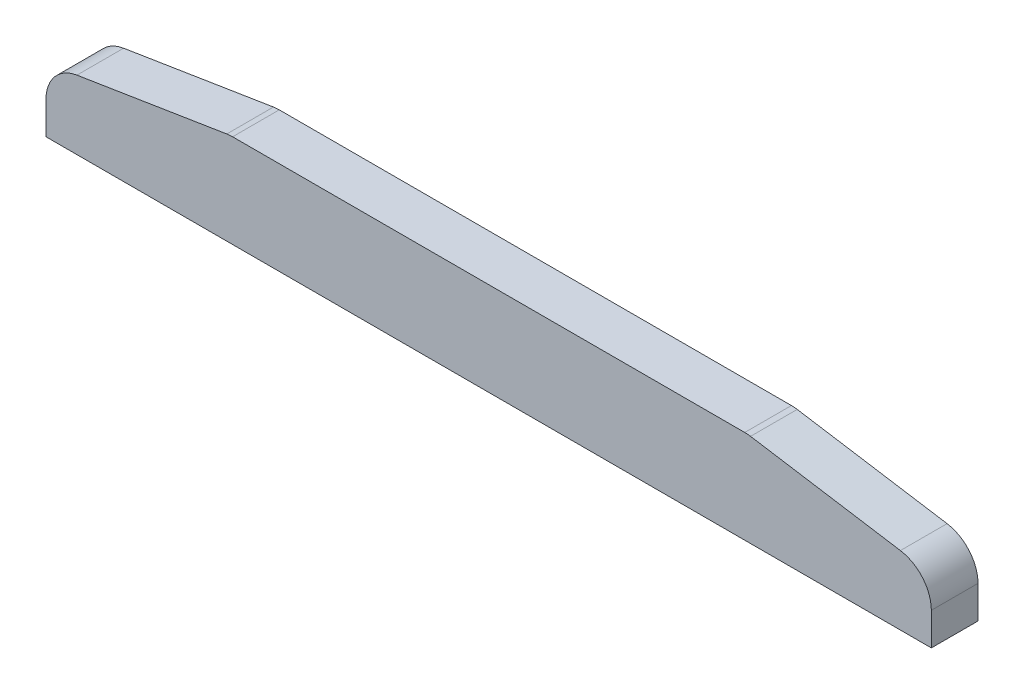
ISO-10303-21;
HEADER;
FILE_DESCRIPTION(('STEP AP214'),'2;1');
FILE_NAME('part.step','',(''),(''),'','','');
FILE_SCHEMA(('AUTOMOTIVE_DESIGN { 1 0 10303 214 1 1 1 1 }'));
ENDSEC;
DATA;
#1=APPLICATION_CONTEXT('core data for automotive mechanical design processes');
#2=APPLICATION_PROTOCOL_DEFINITION('international standard','automotive_design',2000,#1);
#3=PRODUCT_CONTEXT('',#1,'mechanical');
#4=PRODUCT('Part','Part','',(#3));
#5=PRODUCT_RELATED_PRODUCT_CATEGORY('part','',(#4));
#6=PRODUCT_DEFINITION_FORMATION('','',#4);
#7=PRODUCT_DEFINITION_CONTEXT('part definition',#1,'design');
#8=PRODUCT_DEFINITION('design','',#6,#7);
#9=PRODUCT_DEFINITION_SHAPE('','',#8);
#10=(LENGTH_UNIT() NAMED_UNIT(*) SI_UNIT(.MILLI.,.METRE.));
#11=(NAMED_UNIT(*) PLANE_ANGLE_UNIT() SI_UNIT($,.RADIAN.));
#12=(NAMED_UNIT(*) SI_UNIT($,.STERADIAN.) SOLID_ANGLE_UNIT());
#13=UNCERTAINTY_MEASURE_WITH_UNIT(LENGTH_MEASURE(1.E-05),#10,'distance_accuracy_value','');
#14=(GEOMETRIC_REPRESENTATION_CONTEXT(3) GLOBAL_UNCERTAINTY_ASSIGNED_CONTEXT((#13)) GLOBAL_UNIT_ASSIGNED_CONTEXT((#10,
#11,#12)) REPRESENTATION_CONTEXT('',''));
#15=CARTESIAN_POINT('',(0.,0.,0.));
#16=DIRECTION('',(0.,0.,1.));
#17=DIRECTION('',(1.,0.,0.));
#18=AXIS2_PLACEMENT_3D('',#15,#16,#17);
#19=CARTESIAN_POINT('',(120.5,25.4,6.35000000000008));
#20=DIRECTION('',(-1.00000000000005,0.,0.));
#21=DIRECTION('',(0.,0.,1.00000000000005));
#22=AXIS2_PLACEMENT_3D('',#19,#20,#21);
#23=PLANE('',#22);
#24=DIRECTION('',(0.,-1.,0.));
#25=VECTOR('',#24,1.);
#26=CARTESIAN_POINT('',(120.5,25.4,-6.35000000000052));
#27=LINE('',#26,#25);
#28=CARTESIAN_POINT('',(120.5,8.87280887906233,-6.35000000000052));
#29=VERTEX_POINT('',#28);
#30=CARTESIAN_POINT('',(120.5,0.,-6.35000000000008));
#31=VERTEX_POINT('',#30);
#32=EDGE_CURVE('E212',#29,#31,#27,.T.);
#33=ORIENTED_EDGE('',*,*,#32,.F.);
#34=DIRECTION('',(0.,0.,-1.00000000000005));
#35=VECTOR('',#34,1.);
#36=CARTESIAN_POINT('',(120.5,8.87280887906217,6.35000000000008));
#37=LINE('',#36,#35);
#38=CARTESIAN_POINT('',(120.5,8.87280887906217,6.35000000000008));
#39=VERTEX_POINT('',#38);
#40=EDGE_CURVE('E225',#29,#39,#37,.F.);
#41=ORIENTED_EDGE('',*,*,#40,.T.);
#42=DIRECTION('',(0.,-1.,0.));
#43=VECTOR('',#42,1.);
#44=CARTESIAN_POINT('',(120.5,25.4,6.35000000000008));
#45=LINE('',#44,#43);
#46=CARTESIAN_POINT('',(120.5,0.,6.35000000000008));
#47=VERTEX_POINT('',#46);
#48=EDGE_CURVE('E196',#39,#47,#45,.T.);
#49=ORIENTED_EDGE('',*,*,#48,.T.);
#50=DIRECTION('',(0.,0.,-1.00000000000005));
#51=VECTOR('',#50,1.);
#52=CARTESIAN_POINT('',(120.5,0.,6.35000000000008));
#53=LINE('',#52,#51);
#54=EDGE_CURVE('E188',#47,#31,#53,.T.);
#55=ORIENTED_EDGE('',*,*,#54,.T.);
#56=EDGE_LOOP('',(#33,#41,#49,#55));
#57=FACE_BOUND('',#56,.T.);
#58=ADVANCED_FACE('F50',(#57),#23,.F.);
#59=CARTESIAN_POINT('',(-120.500000000001,25.3999999999938,-6.35000000000008));
#60=DIRECTION('',(0.,0.,1.00000000000005));
#61=DIRECTION('',(1.00000000000005,0.,0.));
#62=AXIS2_PLACEMENT_3D('',#59,#60,#61);
#63=PLANE('',#62);
#64=DIRECTION('',(-0.987440631916757,0.157990501106668,0.));
#65=VECTOR('',#64,1.);
#66=CARTESIAN_POINT('',(70.4999999999989,25.4,-6.34999999999997));
#67=LINE('',#66,#65);
#68=CARTESIAN_POINT('',(71.2849605052048,25.274406319167,-6.34999999999997));
#69=VERTEX_POINT('',#68);
#70=CARTESIAN_POINT('',(112.079905011067,18.7472151982294,-6.34999999999986));
#71=VERTEX_POINT('',#70);
#72=EDGE_CURVE('E216',#69,#71,#67,.F.);
#73=ORIENTED_EDGE('',*,*,#72,.T.);
#74=CARTESIAN_POINT('',(110.5,8.87280887906228,-6.34999999999986));
#75=DIRECTION('',(0.,0.,1.00000000000005));
#76=DIRECTION('',(1.00000000000005,0.,0.));
#77=AXIS2_PLACEMENT_3D('',#74,#75,#76);
#78=CIRCLE('',#77,10.);
#79=EDGE_CURVE('E245',#71,#29,#78,.F.);
#80=ORIENTED_EDGE('',*,*,#79,.T.);
#81=ORIENTED_EDGE('',*,*,#32,.T.);
#82=DIRECTION('',(-1.00000000000005,0.,0.));
#83=VECTOR('',#82,1.);
#84=CARTESIAN_POINT('',(-120.5,-6.21724893790088E-12,-6.34999999999986));
#85=LINE('',#84,#83);
#86=CARTESIAN_POINT('',(-120.5,-6.21724893790088E-12,-6.34999999999986));
#87=VERTEX_POINT('',#86);
#88=EDGE_CURVE('E199',#31,#87,#85,.T.);
#89=ORIENTED_EDGE('',*,*,#88,.T.);
#90=DIRECTION('',(0.,-1.,0.));
#91=VECTOR('',#90,1.);
#92=CARTESIAN_POINT('',(-120.500000000001,25.3999999999938,-6.35000000000008));
#93=LINE('',#92,#91);
#94=CARTESIAN_POINT('',(-120.500000000001,8.87280887905606,-6.35000000000008));
#95=VERTEX_POINT('',#94);
#96=EDGE_CURVE('E210',#95,#87,#93,.T.);
#97=ORIENTED_EDGE('',*,*,#96,.F.);
#98=CARTESIAN_POINT('',(-110.500000000001,8.87280887905606,-6.35000000000008));
#99=DIRECTION('',(0.,0.,1.00000000000005));
#100=DIRECTION('',(1.00000000000005,0.,0.));
#101=AXIS2_PLACEMENT_3D('',#98,#99,#100);
#102=CIRCLE('',#101,10.);
#103=CARTESIAN_POINT('',(-112.079905011067,18.7472151982231,-6.35000000000008));
#104=VERTEX_POINT('',#103);
#105=EDGE_CURVE('E71',#95,#104,#102,.F.);
#106=ORIENTED_EDGE('',*,*,#105,.T.);
#107=DIRECTION('',(-0.987440631916754,-0.157990501106671,0.));
#108=VECTOR('',#107,1.);
#109=CARTESIAN_POINT('',(-70.5000000000022,25.3999999999938,-6.35000000000074));
#110=LINE('',#109,#108);
#111=CARTESIAN_POINT('',(-71.2849605052068,25.2744063191609,-6.35000000000041));
#112=VERTEX_POINT('',#111);
#113=EDGE_CURVE('E214',#104,#112,#110,.F.);
#114=ORIENTED_EDGE('',*,*,#113,.T.);
#115=CARTESIAN_POINT('',(-69.7050554941383,15.3999999999938,-6.34999999999997));
#116=DIRECTION('',(0.,0.,1.00000000000005));
#117=DIRECTION('',(1.00000000000005,0.,0.));
#118=AXIS2_PLACEMENT_3D('',#115,#116,#117);
#119=CIRCLE('',#118,10.);
#120=CARTESIAN_POINT('',(-69.7050554941385,25.3999999999938,-6.3500000000003));
#121=VERTEX_POINT('',#120);
#122=EDGE_CURVE('E241',#112,#121,#119,.F.);
#123=ORIENTED_EDGE('',*,*,#122,.T.);
#124=DIRECTION('',(-1.00000000000005,0.,0.));
#125=VECTOR('',#124,1.);
#126=CARTESIAN_POINT('',(-120.500000000001,25.3999999999938,-6.35000000000008));
#127=LINE('',#126,#125);
#128=CARTESIAN_POINT('',(69.7050554941381,25.4,-6.35000000000008));
#129=VERTEX_POINT('',#128);
#130=EDGE_CURVE('E189',#129,#121,#127,.T.);
#131=ORIENTED_EDGE('',*,*,#130,.F.);
#132=CARTESIAN_POINT('',(69.7050554941381,15.4,-6.35000000000008));
#133=DIRECTION('',(0.,0.,1.00000000000005));
#134=DIRECTION('',(1.00000000000005,0.,0.));
#135=AXIS2_PLACEMENT_3D('',#132,#133,#134);
#136=CIRCLE('',#135,10.);
#137=EDGE_CURVE('E243',#129,#69,#136,.F.);
#138=ORIENTED_EDGE('',*,*,#137,.T.);
#139=EDGE_LOOP('',(#73,#80,#81,#89,#97,#106,#114,#123,#131,#138));
#140=FACE_BOUND('',#139,.T.);
#141=ADVANCED_FACE('F266',(#140),#63,.F.);
#142=CARTESIAN_POINT('',(-120.500000000002,25.3999999999939,6.34999999999997));
#143=DIRECTION('',(1.00000000000005,0.,0.));
#144=DIRECTION('',(0.,0.,-1.00000000000005));
#145=AXIS2_PLACEMENT_3D('',#142,#143,#144);
#146=PLANE('',#145);
#147=DIRECTION('',(0.,-1.,0.));
#148=VECTOR('',#147,1.);
#149=CARTESIAN_POINT('',(-120.500000000002,25.3999999999939,6.34999999999997));
#150=LINE('',#149,#148);
#151=CARTESIAN_POINT('',(-120.500000000004,8.87280887905606,6.3500000000003));
#152=VERTEX_POINT('',#151);
#153=CARTESIAN_POINT('',(-120.500000000003,-6.21724893790088E-12,6.35000000000008));
#154=VERTEX_POINT('',#153);
#155=EDGE_CURVE('E208',#152,#154,#150,.T.);
#156=ORIENTED_EDGE('',*,*,#155,.F.);
#157=DIRECTION('',(0.,0.,1.00000000000005));
#158=VECTOR('',#157,1.);
#159=CARTESIAN_POINT('',(-120.500000000001,8.87280887905606,-6.35000000000008));
#160=LINE('',#159,#158);
#161=EDGE_CURVE('E13',#152,#95,#160,.F.);
#162=ORIENTED_EDGE('',*,*,#161,.T.);
#163=ORIENTED_EDGE('',*,*,#96,.T.);
#164=DIRECTION('',(0.,0.,1.00000000000005));
#165=VECTOR('',#164,1.);
#166=CARTESIAN_POINT('',(-120.500000000003,-6.21724893790088E-12,6.35000000000008));
#167=LINE('',#166,#165);
#168=EDGE_CURVE('E202',#87,#154,#167,.T.);
#169=ORIENTED_EDGE('',*,*,#168,.T.);
#170=EDGE_LOOP('',(#156,#162,#163,#169));
#171=FACE_BOUND('',#170,.T.);
#172=ADVANCED_FACE('F265',(#171),#146,.F.);
#173=CARTESIAN_POINT('',(-120.500000000002,25.3999999999939,6.34999999999997));
#174=DIRECTION('',(0.,0.,-1.00000000000005));
#175=DIRECTION('',(-1.00000000000005,0.,0.));
#176=AXIS2_PLACEMENT_3D('',#173,#174,#175);
#177=PLANE('',#176);
#178=ORIENTED_EDGE('',*,*,#48,.F.);
#179=CARTESIAN_POINT('',(110.5,8.87280887906217,6.3500000000003));
#180=DIRECTION('',(0.,0.,-1.00000000000005));
#181=DIRECTION('',(-1.00000000000005,0.,0.));
#182=AXIS2_PLACEMENT_3D('',#179,#180,#181);
#183=CIRCLE('',#182,10.);
#184=CARTESIAN_POINT('',(112.079905011067,18.7472151982293,6.35000000000008));
#185=VERTEX_POINT('',#184);
#186=EDGE_CURVE('E234',#39,#185,#183,.F.);
#187=ORIENTED_EDGE('',*,*,#186,.T.);
#188=DIRECTION('',(0.987440631916757,-0.157990501106668,0.));
#189=VECTOR('',#188,1.);
#190=CARTESIAN_POINT('',(70.4999999999989,25.4,6.34999999999997));
#191=LINE('',#190,#189);
#192=CARTESIAN_POINT('',(71.2849605052048,25.274406319167,6.35000000000041));
#193=VERTEX_POINT('',#192);
#194=EDGE_CURVE('E222',#185,#193,#191,.F.);
#195=ORIENTED_EDGE('',*,*,#194,.T.);
#196=CARTESIAN_POINT('',(69.7050554941383,15.4,6.34999999999997));
#197=DIRECTION('',(0.,0.,-1.00000000000005));
#198=DIRECTION('',(-1.00000000000005,0.,0.));
#199=AXIS2_PLACEMENT_3D('',#196,#197,#198);
#200=CIRCLE('',#199,10.);
#201=CARTESIAN_POINT('',(69.7050554941383,25.4,6.34999999999997));
#202=VERTEX_POINT('',#201);
#203=EDGE_CURVE('E232',#193,#202,#200,.F.);
#204=ORIENTED_EDGE('',*,*,#203,.T.);
#205=DIRECTION('',(1.00000000000005,0.,0.));
#206=VECTOR('',#205,1.);
#207=CARTESIAN_POINT('',(-120.500000000002,25.3999999999939,6.34999999999997));
#208=LINE('',#207,#206);
#209=CARTESIAN_POINT('',(-69.7050554941392,25.3999999999939,6.34999999999963));
#210=VERTEX_POINT('',#209);
#211=EDGE_CURVE('E192',#210,#202,#208,.T.);
#212=ORIENTED_EDGE('',*,*,#211,.F.);
#213=CARTESIAN_POINT('',(-69.7050554941383,15.3999999999939,6.34999999999986));
#214=DIRECTION('',(0.,0.,-1.00000000000005));
#215=DIRECTION('',(-1.00000000000005,0.,0.));
#216=AXIS2_PLACEMENT_3D('',#213,#214,#215);
#217=CIRCLE('',#216,10.);
#218=CARTESIAN_POINT('',(-71.2849605052059,25.2744063191609,6.34999999999986));
#219=VERTEX_POINT('',#218);
#220=EDGE_CURVE('E230',#210,#219,#217,.F.);
#221=ORIENTED_EDGE('',*,*,#220,.T.);
#222=DIRECTION('',(0.987440631916754,0.157990501106671,0.));
#223=VECTOR('',#222,1.);
#224=CARTESIAN_POINT('',(-70.4999999999996,25.3999999999939,6.34999999999986));
#225=LINE('',#224,#223);
#226=CARTESIAN_POINT('',(-112.07990501107,18.7472151982231,6.34999999999963));
#227=VERTEX_POINT('',#226);
#228=EDGE_CURVE('E219',#219,#227,#225,.F.);
#229=ORIENTED_EDGE('',*,*,#228,.T.);
#230=CARTESIAN_POINT('',(-110.500000000001,8.87280887906211,6.35000000000019));
#231=DIRECTION('',(0.,0.,-1.00000000000005));
#232=DIRECTION('',(-1.00000000000005,0.,0.));
#233=AXIS2_PLACEMENT_3D('',#230,#231,#232);
#234=CIRCLE('',#233,10.);
#235=EDGE_CURVE('E228',#227,#152,#234,.F.);
#236=ORIENTED_EDGE('',*,*,#235,.T.);
#237=ORIENTED_EDGE('',*,*,#155,.T.);
#238=DIRECTION('',(1.00000000000005,0.,0.));
#239=VECTOR('',#238,1.);
#240=CARTESIAN_POINT('',(-120.500000000003,-6.21724893790088E-12,6.35000000000008));
#241=LINE('',#240,#239);
#242=EDGE_CURVE('E193',#154,#47,#241,.T.);
#243=ORIENTED_EDGE('',*,*,#242,.T.);
#244=EDGE_LOOP('',(#178,#187,#195,#204,#212,#221,#229,#236,#237,#243));
#245=FACE_BOUND('',#244,.T.);
#246=ADVANCED_FACE('F260',(#245),#177,.F.);
#247=CARTESIAN_POINT('',(0.,25.4,0.));
#248=DIRECTION('',(0.,-1.,0.));
#249=DIRECTION('',(0.,0.,-1.00000000000005));
#250=AXIS2_PLACEMENT_3D('',#247,#248,#249);
#251=PLANE('',#250);
#252=ORIENTED_EDGE('',*,*,#211,.T.);
#253=DIRECTION('',(0.,0.,1.00000000000005));
#254=VECTOR('',#253,1.);
#255=CARTESIAN_POINT('',(69.7050554941381,25.4,-6.35000000000008));
#256=LINE('',#255,#254);
#257=EDGE_CURVE('E250',#202,#129,#256,.F.);
#258=ORIENTED_EDGE('',*,*,#257,.T.);
#259=ORIENTED_EDGE('',*,*,#130,.T.);
#260=DIRECTION('',(0.,0.,-1.00000000000005));
#261=VECTOR('',#260,1.);
#262=CARTESIAN_POINT('',(-69.7050554941392,25.3999999999939,6.34999999999963));
#263=LINE('',#262,#261);
#264=EDGE_CURVE('E247',#121,#210,#263,.F.);
#265=ORIENTED_EDGE('',*,*,#264,.T.);
#266=EDGE_LOOP('',(#252,#258,#259,#265));
#267=FACE_BOUND('',#266,.T.);
#268=ADVANCED_FACE('F291',(#267),#251,.F.);
#269=CARTESIAN_POINT('',(0.,0.,0.));
#270=DIRECTION('',(0.,-1.,0.));
#271=DIRECTION('',(0.,0.,-1.00000000000005));
#272=AXIS2_PLACEMENT_3D('',#269,#270,#271);
#273=PLANE('',#272);
#274=CARTESIAN_POINT('',(-112.5,-6.21724893790088E-12,0.));
#275=DIRECTION('',(0.,-1.,0.));
#276=DIRECTION('',(0.,0.,-1.00000000000005));
#277=AXIS2_PLACEMENT_3D('',#274,#275,#276);
#278=CIRCLE('',#277,2.09999999999999);
#279=CARTESIAN_POINT('',(-112.5,-6.21974521069131E-12,-2.10000000000009));
#280=VERTEX_POINT('',#279);
#281=EDGE_CURVE('E154',#280,#280,#278,.T.);
#282=ORIENTED_EDGE('',*,*,#281,.F.);
#283=EDGE_LOOP('',(#282));
#284=FACE_BOUND('',#283,.T.);
#285=CARTESIAN_POINT('',(-67.5000000000001,-6.21724893790088E-12,0.));
#286=DIRECTION('',(0.,-1.,0.));
#287=DIRECTION('',(0.,0.,-1.00000000000005));
#288=AXIS2_PLACEMENT_3D('',#285,#286,#287);
#289=CIRCLE('',#288,2.09999999999999);
#290=CARTESIAN_POINT('',(-67.5000000000001,-6.21974521069131E-12,-2.10000000000009));
#291=VERTEX_POINT('',#290);
#292=EDGE_CURVE('E153',#291,#291,#289,.T.);
#293=ORIENTED_EDGE('',*,*,#292,.F.);
#294=EDGE_LOOP('',(#293));
#295=FACE_BOUND('',#294,.T.);
#296=CARTESIAN_POINT('',(-22.5000000000009,0.,1.11022302462516E-13));
#297=DIRECTION('',(0.,-1.,0.));
#298=DIRECTION('',(0.,0.,-1.00000000000005));
#299=AXIS2_PLACEMENT_3D('',#296,#297,#298);
#300=CIRCLE('',#299,2.09999999999999);
#301=CARTESIAN_POINT('',(-22.5000000000009,0.,-2.09999999999998));
#302=VERTEX_POINT('',#301);
#303=EDGE_CURVE('E164',#302,#302,#300,.T.);
#304=ORIENTED_EDGE('',*,*,#303,.F.);
#305=EDGE_LOOP('',(#304));
#306=FACE_BOUND('',#305,.T.);
#307=CARTESIAN_POINT('',(22.5,0.,-2.22044604925031E-13));
#308=DIRECTION('',(0.,-1.,0.));
#309=DIRECTION('',(0.,0.,-1.00000000000005));
#310=AXIS2_PLACEMENT_3D('',#307,#308,#309);
#311=CIRCLE('',#310,2.09999999999999);
#312=CARTESIAN_POINT('',(22.5,0.,-2.10000000000032));
#313=VERTEX_POINT('',#312);
#314=EDGE_CURVE('E170',#313,#313,#311,.T.);
#315=ORIENTED_EDGE('',*,*,#314,.F.);
#316=EDGE_LOOP('',(#315));
#317=FACE_BOUND('',#316,.T.);
#318=CARTESIAN_POINT('',(67.4999999999999,0.,-2.22044604925031E-13));
#319=DIRECTION('',(0.,-1.,0.));
#320=DIRECTION('',(0.,0.,-1.00000000000005));
#321=AXIS2_PLACEMENT_3D('',#318,#319,#320);
#322=CIRCLE('',#321,2.09999999999999);
#323=CARTESIAN_POINT('',(67.4999999999999,0.,-2.10000000000032));
#324=VERTEX_POINT('',#323);
#325=EDGE_CURVE('E176',#324,#324,#322,.T.);
#326=ORIENTED_EDGE('',*,*,#325,.F.);
#327=EDGE_LOOP('',(#326));
#328=FACE_BOUND('',#327,.T.);
#329=CARTESIAN_POINT('',(112.5,0.,0.));
#330=DIRECTION('',(0.,-1.,0.));
#331=DIRECTION('',(0.,0.,-1.00000000000005));
#332=AXIS2_PLACEMENT_3D('',#329,#330,#331);
#333=CIRCLE('',#332,2.09999999999999);
#334=CARTESIAN_POINT('',(112.5,0.,-2.10000000000009));
#335=VERTEX_POINT('',#334);
#336=EDGE_CURVE('E182',#335,#335,#333,.T.);
#337=ORIENTED_EDGE('',*,*,#336,.F.);
#338=EDGE_LOOP('',(#337));
#339=FACE_BOUND('',#338,.T.);
#340=ORIENTED_EDGE('',*,*,#54,.F.);
#341=ORIENTED_EDGE('',*,*,#242,.F.);
#342=ORIENTED_EDGE('',*,*,#168,.F.);
#343=ORIENTED_EDGE('',*,*,#88,.F.);
#344=EDGE_LOOP('',(#340,#341,#342,#343));
#345=FACE_BOUND('',#344,.T.);
#346=ADVANCED_FACE('F273',(#284,#295,#306,#317,#328,#339,#345),#273,.T.);
#347=CARTESIAN_POINT('',(70.4999999999987,25.4,-2.22044604925031E-13));
#348=DIRECTION('',(-0.157990501106679,-0.987440631916706,0.));
#349=DIRECTION('',(0.,0.,-1.00000000000005));
#350=AXIS2_PLACEMENT_3D('',#347,#348,#349);
#351=PLANE('',#350);
#352=ORIENTED_EDGE('',*,*,#194,.F.);
#353=DIRECTION('',(0.,0.,1.00000000000005));
#354=VECTOR('',#353,1.);
#355=CARTESIAN_POINT('',(112.079905011067,18.7472151982294,-6.34999999999986));
#356=LINE('',#355,#354);
#357=EDGE_CURVE('E238',#185,#71,#356,.F.);
#358=ORIENTED_EDGE('',*,*,#357,.T.);
#359=ORIENTED_EDGE('',*,*,#72,.F.);
#360=DIRECTION('',(0.,0.,-1.00000000000005));
#361=VECTOR('',#360,1.);
#362=CARTESIAN_POINT('',(71.2849605052048,25.274406319167,6.35000000000041));
#363=LINE('',#362,#361);
#364=EDGE_CURVE('E236',#69,#193,#363,.F.);
#365=ORIENTED_EDGE('',*,*,#364,.T.);
#366=EDGE_LOOP('',(#352,#358,#359,#365));
#367=FACE_BOUND('',#366,.T.);
#368=ADVANCED_FACE('F283',(#367),#351,.F.);
#369=CARTESIAN_POINT('',(-70.4999999999991,25.3999999999938,1.11022302462516E-13));
#370=DIRECTION('',(0.157990501106677,-0.987440631916706,0.));
#371=DIRECTION('',(0.,0.,1.00000000000005));
#372=AXIS2_PLACEMENT_3D('',#369,#370,#371);
#373=PLANE('',#372);
#374=ORIENTED_EDGE('',*,*,#228,.F.);
#375=DIRECTION('',(0.,0.,1.00000000000005));
#376=VECTOR('',#375,1.);
#377=CARTESIAN_POINT('',(-71.284960505205,25.2744063191609,-6.35000000000008));
#378=LINE('',#377,#376);
#379=EDGE_CURVE('E58',#219,#112,#378,.F.);
#380=ORIENTED_EDGE('',*,*,#379,.T.);
#381=ORIENTED_EDGE('',*,*,#113,.F.);
#382=DIRECTION('',(0.,0.,-1.00000000000005));
#383=VECTOR('',#382,1.);
#384=CARTESIAN_POINT('',(-112.07990501107,18.7472151982231,6.34999999999963));
#385=LINE('',#384,#383);
#386=EDGE_CURVE('E253',#104,#227,#385,.F.);
#387=ORIENTED_EDGE('',*,*,#386,.T.);
#388=EDGE_LOOP('',(#374,#380,#381,#387));
#389=FACE_BOUND('',#388,.T.);
#390=ADVANCED_FACE('F255',(#389),#373,.F.);
#391=CARTESIAN_POINT('',(112.5,12.0000000000001,0.));
#392=DIRECTION('',(0.,-1.,0.));
#393=DIRECTION('',(0.,0.,-1.00000000000005));
#394=AXIS2_PLACEMENT_3D('',#391,#392,#393);
#395=CONICAL_SURFACE('',#394,2.09999999999999,1.02974425867665);
#396=CARTESIAN_POINT('',(112.5,13.2618072999579,0.));
#397=VERTEX_POINT('',#396);
#398=VERTEX_LOOP('',#397);
#399=FACE_BOUND('',#398,.T.);
#400=CARTESIAN_POINT('',(112.5,12.0000000000001,0.));
#401=DIRECTION('',(0.,-1.,0.));
#402=DIRECTION('',(0.,0.,-1.00000000000005));
#403=AXIS2_PLACEMENT_3D('',#400,#401,#402);
#404=CIRCLE('',#403,2.09999999999999);
#405=CARTESIAN_POINT('',(112.5,12.0000000000001,-2.10000000000009));
#406=VERTEX_POINT('',#405);
#407=EDGE_CURVE('E185',#406,#406,#404,.T.);
#408=ORIENTED_EDGE('',*,*,#407,.T.);
#409=EDGE_LOOP('',(#408));
#410=FACE_BOUND('',#409,.T.);
#411=ADVANCED_FACE('F314',(#399,#410),#395,.F.);
#412=CARTESIAN_POINT('',(112.5,0.,0.));
#413=DIRECTION('',(0.,-1.,0.));
#414=DIRECTION('',(0.,0.,-1.00000000000005));
#415=AXIS2_PLACEMENT_3D('',#412,#413,#414);
#416=CYLINDRICAL_SURFACE('',#415,2.09999999999999);
#417=ORIENTED_EDGE('',*,*,#407,.F.);
#418=EDGE_LOOP('',(#417));
#419=FACE_BOUND('',#418,.T.);
#420=ORIENTED_EDGE('',*,*,#336,.T.);
#421=EDGE_LOOP('',(#420));
#422=FACE_BOUND('',#421,.T.);
#423=ADVANCED_FACE('F354',(#419,#422),#416,.F.);
#424=CARTESIAN_POINT('',(67.4999999999999,12.,-2.22044604925031E-13));
#425=DIRECTION('',(0.,-1.,0.));
#426=DIRECTION('',(0.,0.,-1.00000000000005));
#427=AXIS2_PLACEMENT_3D('',#424,#425,#426);
#428=CONICAL_SURFACE('',#427,2.09999999999999,1.02974425867665);
#429=CARTESIAN_POINT('',(67.4999999999999,13.2618072999579,-2.22044604925031E-13));
#430=VERTEX_POINT('',#429);
#431=VERTEX_LOOP('',#430);
#432=FACE_BOUND('',#431,.T.);
#433=CARTESIAN_POINT('',(67.4999999999999,12.,-2.22044604925031E-13));
#434=DIRECTION('',(0.,-1.,0.));
#435=DIRECTION('',(0.,0.,-1.00000000000005));
#436=AXIS2_PLACEMENT_3D('',#433,#434,#435);
#437=CIRCLE('',#436,2.09999999999999);
#438=CARTESIAN_POINT('',(67.4999999999999,12.,-2.10000000000032));
#439=VERTEX_POINT('',#438);
#440=EDGE_CURVE('E179',#439,#439,#437,.T.);
#441=ORIENTED_EDGE('',*,*,#440,.T.);
#442=EDGE_LOOP('',(#441));
#443=FACE_BOUND('',#442,.T.);
#444=ADVANCED_FACE('F350',(#432,#443),#428,.F.);
#445=CARTESIAN_POINT('',(67.4999999999999,0.,-2.22044604925031E-13));
#446=DIRECTION('',(0.,-1.,0.));
#447=DIRECTION('',(0.,0.,-1.00000000000005));
#448=AXIS2_PLACEMENT_3D('',#445,#446,#447);
#449=CYLINDRICAL_SURFACE('',#448,2.09999999999999);
#450=ORIENTED_EDGE('',*,*,#440,.F.);
#451=EDGE_LOOP('',(#450));
#452=FACE_BOUND('',#451,.T.);
#453=ORIENTED_EDGE('',*,*,#325,.T.);
#454=EDGE_LOOP('',(#453));
#455=FACE_BOUND('',#454,.T.);
#456=ADVANCED_FACE('F346',(#452,#455),#449,.F.);
#457=CARTESIAN_POINT('',(22.5,12.,-2.22044604925031E-13));
#458=DIRECTION('',(0.,-1.,0.));
#459=DIRECTION('',(0.,0.,-1.00000000000005));
#460=AXIS2_PLACEMENT_3D('',#457,#458,#459);
#461=CONICAL_SURFACE('',#460,2.1,1.02974425867665);
#462=CARTESIAN_POINT('',(22.5,13.2618072999579,-2.22044604925031E-13));
#463=VERTEX_POINT('',#462);
#464=VERTEX_LOOP('',#463);
#465=FACE_BOUND('',#464,.T.);
#466=CARTESIAN_POINT('',(22.5,12.,-2.22044604925031E-13));
#467=DIRECTION('',(0.,-1.,0.));
#468=DIRECTION('',(0.,0.,-1.00000000000005));
#469=AXIS2_PLACEMENT_3D('',#466,#467,#468);
#470=CIRCLE('',#469,2.1);
#471=CARTESIAN_POINT('',(22.5,12.,-2.10000000000032));
#472=VERTEX_POINT('',#471);
#473=EDGE_CURVE('E173',#472,#472,#470,.T.);
#474=ORIENTED_EDGE('',*,*,#473,.T.);
#475=EDGE_LOOP('',(#474));
#476=FACE_BOUND('',#475,.T.);
#477=ADVANCED_FACE('F342',(#465,#476),#461,.F.);
#478=CARTESIAN_POINT('',(22.5,0.,-2.22044604925031E-13));
#479=DIRECTION('',(0.,-1.,0.));
#480=DIRECTION('',(0.,0.,-1.00000000000005));
#481=AXIS2_PLACEMENT_3D('',#478,#479,#480);
#482=CYLINDRICAL_SURFACE('',#481,2.09999999999999);
#483=ORIENTED_EDGE('',*,*,#473,.F.);
#484=EDGE_LOOP('',(#483));
#485=FACE_BOUND('',#484,.T.);
#486=ORIENTED_EDGE('',*,*,#314,.T.);
#487=EDGE_LOOP('',(#486));
#488=FACE_BOUND('',#487,.T.);
#489=ADVANCED_FACE('F338',(#485,#488),#482,.F.);
#490=CARTESIAN_POINT('',(-22.5000000000009,12.,1.11022302462516E-13));
#491=DIRECTION('',(0.,-1.,0.));
#492=DIRECTION('',(0.,0.,-1.00000000000005));
#493=AXIS2_PLACEMENT_3D('',#490,#491,#492);
#494=CONICAL_SURFACE('',#493,2.1,1.02974425867665);
#495=CARTESIAN_POINT('',(-22.5000000000009,13.2618072999578,1.11022302462516E-13));
#496=VERTEX_POINT('',#495);
#497=VERTEX_LOOP('',#496);
#498=FACE_BOUND('',#497,.T.);
#499=CARTESIAN_POINT('',(-22.5000000000009,12.,1.11022302462516E-13));
#500=DIRECTION('',(0.,-1.,0.));
#501=DIRECTION('',(0.,0.,-1.00000000000005));
#502=AXIS2_PLACEMENT_3D('',#499,#500,#501);
#503=CIRCLE('',#502,2.1);
#504=CARTESIAN_POINT('',(-22.5000000000009,12.,-2.09999999999999));
#505=VERTEX_POINT('',#504);
#506=EDGE_CURVE('E167',#505,#505,#503,.T.);
#507=ORIENTED_EDGE('',*,*,#506,.T.);
#508=EDGE_LOOP('',(#507));
#509=FACE_BOUND('',#508,.T.);
#510=ADVANCED_FACE('F334',(#498,#509),#494,.F.);
#511=CARTESIAN_POINT('',(-22.5000000000009,0.,1.11022302462516E-13));
#512=DIRECTION('',(0.,-1.,0.));
#513=DIRECTION('',(0.,0.,-1.00000000000005));
#514=AXIS2_PLACEMENT_3D('',#511,#512,#513);
#515=CYLINDRICAL_SURFACE('',#514,2.09999999999999);
#516=ORIENTED_EDGE('',*,*,#506,.F.);
#517=EDGE_LOOP('',(#516));
#518=FACE_BOUND('',#517,.T.);
#519=ORIENTED_EDGE('',*,*,#303,.T.);
#520=EDGE_LOOP('',(#519));
#521=FACE_BOUND('',#520,.T.);
#522=ADVANCED_FACE('F330',(#518,#521),#515,.F.);
#523=CARTESIAN_POINT('',(-67.5000000000001,11.9999999999938,0.));
#524=DIRECTION('',(0.,-1.,0.));
#525=DIRECTION('',(0.,0.,-1.00000000000005));
#526=AXIS2_PLACEMENT_3D('',#523,#524,#525);
#527=CONICAL_SURFACE('',#526,2.09999999999999,1.02974425867665);
#528=CARTESIAN_POINT('',(-67.5000000000001,13.2618072999517,0.));
#529=VERTEX_POINT('',#528);
#530=VERTEX_LOOP('',#529);
#531=FACE_BOUND('',#530,.T.);
#532=CARTESIAN_POINT('',(-67.5000000000001,11.9999999999938,0.));
#533=DIRECTION('',(0.,-1.,0.));
#534=DIRECTION('',(0.,0.,-1.00000000000005));
#535=AXIS2_PLACEMENT_3D('',#532,#533,#534);
#536=CIRCLE('',#535,2.09999999999999);
#537=CARTESIAN_POINT('',(-67.5000000000001,11.9999999999938,-2.10000000000009));
#538=VERTEX_POINT('',#537);
#539=EDGE_CURVE('E157',#538,#538,#536,.T.);
#540=ORIENTED_EDGE('',*,*,#539,.T.);
#541=EDGE_LOOP('',(#540));
#542=FACE_BOUND('',#541,.T.);
#543=ADVANCED_FACE('F326',(#531,#542),#527,.F.);
#544=CARTESIAN_POINT('',(-67.5000000000001,-6.21724893790088E-12,0.));
#545=DIRECTION('',(0.,-1.,0.));
#546=DIRECTION('',(0.,0.,-1.00000000000005));
#547=AXIS2_PLACEMENT_3D('',#544,#545,#546);
#548=CYLINDRICAL_SURFACE('',#547,2.09999999999999);
#549=ORIENTED_EDGE('',*,*,#539,.F.);
#550=EDGE_LOOP('',(#549));
#551=FACE_BOUND('',#550,.T.);
#552=ORIENTED_EDGE('',*,*,#292,.T.);
#553=EDGE_LOOP('',(#552));
#554=FACE_BOUND('',#553,.T.);
#555=ADVANCED_FACE('F147',(#551,#554),#548,.F.);
#556=CARTESIAN_POINT('',(-112.5,11.9999999999938,0.));
#557=DIRECTION('',(0.,-1.,0.));
#558=DIRECTION('',(0.,0.,-1.00000000000005));
#559=AXIS2_PLACEMENT_3D('',#556,#557,#558);
#560=CONICAL_SURFACE('',#559,2.09999999999999,1.02974425867665);
#561=CARTESIAN_POINT('',(-112.5,13.2618072999517,0.));
#562=VERTEX_POINT('',#561);
#563=VERTEX_LOOP('',#562);
#564=FACE_BOUND('',#563,.T.);
#565=CARTESIAN_POINT('',(-112.5,11.9999999999938,0.));
#566=DIRECTION('',(0.,-1.,0.));
#567=DIRECTION('',(0.,0.,-1.00000000000005));
#568=AXIS2_PLACEMENT_3D('',#565,#566,#567);
#569=CIRCLE('',#568,2.09999999999999);
#570=CARTESIAN_POINT('',(-112.5,11.9999999999938,-2.10000000000009));
#571=VERTEX_POINT('',#570);
#572=EDGE_CURVE('E151',#571,#571,#569,.T.);
#573=ORIENTED_EDGE('',*,*,#572,.T.);
#574=EDGE_LOOP('',(#573));
#575=FACE_BOUND('',#574,.T.);
#576=ADVANCED_FACE('F143',(#564,#575),#560,.F.);
#577=CARTESIAN_POINT('',(-112.5,-6.21724893790088E-12,0.));
#578=DIRECTION('',(0.,-1.,0.));
#579=DIRECTION('',(0.,0.,-1.00000000000005));
#580=AXIS2_PLACEMENT_3D('',#577,#578,#579);
#581=CYLINDRICAL_SURFACE('',#580,2.09999999999999);
#582=ORIENTED_EDGE('',*,*,#572,.F.);
#583=EDGE_LOOP('',(#582));
#584=FACE_BOUND('',#583,.T.);
#585=ORIENTED_EDGE('',*,*,#281,.T.);
#586=EDGE_LOOP('',(#585));
#587=FACE_BOUND('',#586,.T.);
#588=ADVANCED_FACE('F146',(#584,#587),#581,.F.);
#589=CARTESIAN_POINT('',(110.5,8.87280887906217,6.3500000000003));
#590=DIRECTION('',(0.,0.,1.00000000000005));
#591=DIRECTION('',(1.00000000000005,0.,0.));
#592=AXIS2_PLACEMENT_3D('',#589,#590,#591);
#593=CYLINDRICAL_SURFACE('',#592,10.);
#594=ORIENTED_EDGE('',*,*,#79,.F.);
#595=ORIENTED_EDGE('',*,*,#357,.F.);
#596=ORIENTED_EDGE('',*,*,#186,.F.);
#597=ORIENTED_EDGE('',*,*,#40,.F.);
#598=EDGE_LOOP('',(#594,#595,#596,#597));
#599=FACE_BOUND('',#598,.T.);
#600=ADVANCED_FACE('F279',(#599),#593,.T.);
#601=CARTESIAN_POINT('',(69.7050554941381,15.4,0.));
#602=DIRECTION('',(0.,0.,-1.00000000000005));
#603=DIRECTION('',(-1.00000000000005,0.,0.));
#604=AXIS2_PLACEMENT_3D('',#601,#602,#603);
#605=CYLINDRICAL_SURFACE('',#604,10.);
#606=ORIENTED_EDGE('',*,*,#203,.F.);
#607=ORIENTED_EDGE('',*,*,#364,.F.);
#608=ORIENTED_EDGE('',*,*,#137,.F.);
#609=ORIENTED_EDGE('',*,*,#257,.F.);
#610=EDGE_LOOP('',(#606,#607,#608,#609));
#611=FACE_BOUND('',#610,.T.);
#612=ADVANCED_FACE('F289',(#611),#605,.T.);
#613=CARTESIAN_POINT('',(-69.7050554941394,15.3999999999939,2.22044604925031E-13));
#614=DIRECTION('',(0.,0.,1.00000000000005));
#615=DIRECTION('',(1.00000000000005,0.,0.));
#616=AXIS2_PLACEMENT_3D('',#613,#614,#615);
#617=CYLINDRICAL_SURFACE('',#616,10.);
#618=ORIENTED_EDGE('',*,*,#122,.F.);
#619=ORIENTED_EDGE('',*,*,#379,.F.);
#620=ORIENTED_EDGE('',*,*,#220,.F.);
#621=ORIENTED_EDGE('',*,*,#264,.F.);
#622=EDGE_LOOP('',(#618,#619,#620,#621));
#623=FACE_BOUND('',#622,.T.);
#624=ADVANCED_FACE('F295',(#623),#617,.T.);
#625=CARTESIAN_POINT('',(-110.500000000001,8.87280887906211,6.35000000000019));
#626=DIRECTION('',(0.,0.,-1.00000000000005));
#627=DIRECTION('',(-1.00000000000005,0.,0.));
#628=AXIS2_PLACEMENT_3D('',#625,#626,#627);
#629=CYLINDRICAL_SURFACE('',#628,10.);
#630=ORIENTED_EDGE('',*,*,#235,.F.);
#631=ORIENTED_EDGE('',*,*,#386,.F.);
#632=ORIENTED_EDGE('',*,*,#105,.F.);
#633=ORIENTED_EDGE('',*,*,#161,.F.);
#634=EDGE_LOOP('',(#630,#631,#632,#633));
#635=FACE_BOUND('',#634,.T.);
#636=ADVANCED_FACE('F52',(#635),#629,.T.);
#637=CLOSED_SHELL('',(#58,#141,#172,#246,#268,#346,#368,#390,#411,#423,#444,#456,#477,#489,#510,
#522,#543,#555,#576,#588,#600,#612,#624,#636));
#638=MANIFOLD_SOLID_BREP('B2',#637);
#639=ADVANCED_BREP_SHAPE_REPRESENTATION('',(#18,#638),#14);
#640=SHAPE_DEFINITION_REPRESENTATION(#9,#639);
ENDSEC;
END-ISO-10303-21;
